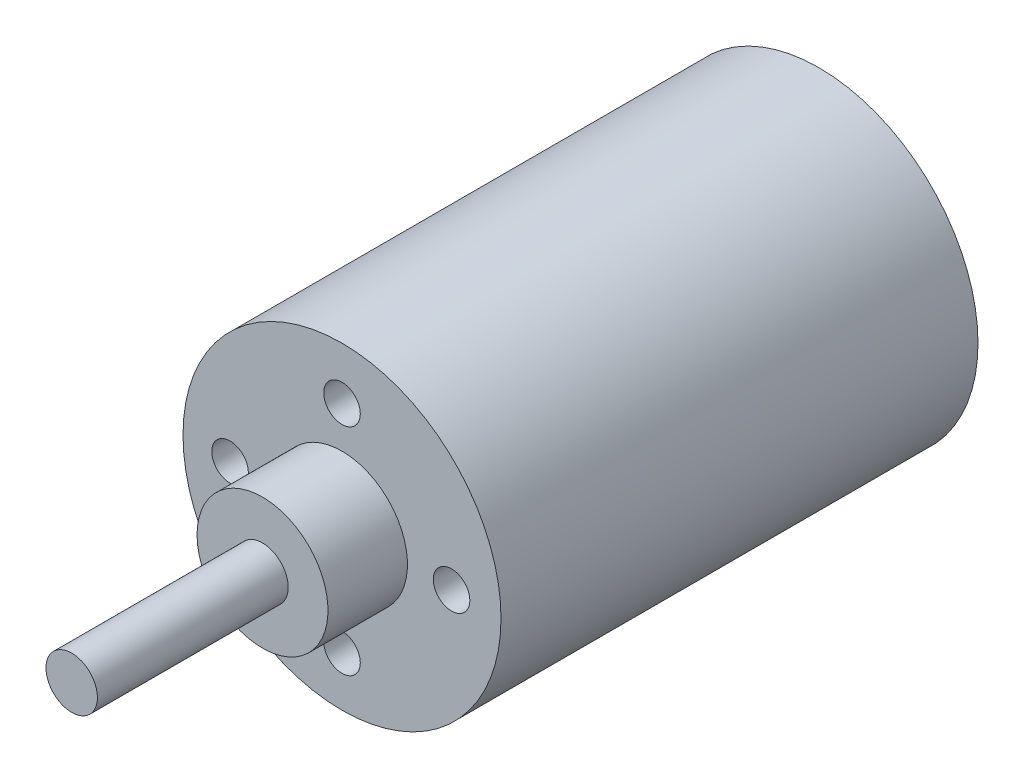
ISO-10303-21;
HEADER;
FILE_DESCRIPTION(('STEP AP214'),'2;1');
FILE_NAME('part.step','',(''),(''),'','','');
FILE_SCHEMA(('AUTOMOTIVE_DESIGN { 1 0 10303 214 1 1 1 1 }'));
ENDSEC;
DATA;
#1=APPLICATION_CONTEXT('core data for automotive mechanical design processes');
#2=APPLICATION_PROTOCOL_DEFINITION('international standard','automotive_design',2000,#1);
#3=PRODUCT_CONTEXT('',#1,'mechanical');
#4=PRODUCT('Part','Part','',(#3));
#5=PRODUCT_RELATED_PRODUCT_CATEGORY('part','',(#4));
#6=PRODUCT_DEFINITION_FORMATION('','',#4);
#7=PRODUCT_DEFINITION_CONTEXT('part definition',#1,'design');
#8=PRODUCT_DEFINITION('design','',#6,#7);
#9=PRODUCT_DEFINITION_SHAPE('','',#8);
#10=(LENGTH_UNIT() NAMED_UNIT(*) SI_UNIT(.MILLI.,.METRE.));
#11=(NAMED_UNIT(*) PLANE_ANGLE_UNIT() SI_UNIT($,.RADIAN.));
#12=(NAMED_UNIT(*) SI_UNIT($,.STERADIAN.) SOLID_ANGLE_UNIT());
#13=UNCERTAINTY_MEASURE_WITH_UNIT(LENGTH_MEASURE(1.E-05),#10,'distance_accuracy_value','');
#14=(GEOMETRIC_REPRESENTATION_CONTEXT(3) GLOBAL_UNCERTAINTY_ASSIGNED_CONTEXT((#13)) GLOBAL_UNIT_ASSIGNED_CONTEXT((#10,
#11,#12)) REPRESENTATION_CONTEXT('',''));
#15=CARTESIAN_POINT('',(0.,0.,0.));
#16=DIRECTION('',(0.,0.,1.));
#17=DIRECTION('',(1.,0.,0.));
#18=AXIS2_PLACEMENT_3D('',#15,#16,#17);
#19=CARTESIAN_POINT('',(0.,0.,-14.9999999999932));
#20=DIRECTION('',(0.,0.,-1.));
#21=DIRECTION('',(-1.,0.,0.));
#22=AXIS2_PLACEMENT_3D('',#19,#20,#21);
#23=CYLINDRICAL_SURFACE('',#22,4.11653290228397);
#24=CARTESIAN_POINT('',(0.,0.,20.));
#25=DIRECTION('',(0.,0.,-1.));
#26=DIRECTION('',(-1.,0.,0.));
#27=AXIS2_PLACEMENT_3D('',#24,#25,#26);
#28=CIRCLE('',#27,4.11653290228397);
#29=CARTESIAN_POINT('',(-4.11653290228397,0.,20.));
#30=VERTEX_POINT('',#29);
#31=EDGE_CURVE('E11',#30,#30,#28,.T.);
#32=ORIENTED_EDGE('',*,*,#31,.T.);
#33=EDGE_LOOP('',(#32));
#34=FACE_BOUND('',#33,.T.);
#35=CARTESIAN_POINT('',(0.,0.,15.));
#36=DIRECTION('',(0.,0.,-1.));
#37=DIRECTION('',(-1.,0.,0.));
#38=AXIS2_PLACEMENT_3D('',#35,#36,#37);
#39=CIRCLE('',#38,4.11653290228397);
#40=CARTESIAN_POINT('',(-4.11653290228397,0.,15.));
#41=VERTEX_POINT('',#40);
#42=EDGE_CURVE('E90',#41,#41,#39,.T.);
#43=ORIENTED_EDGE('',*,*,#42,.F.);
#44=EDGE_LOOP('',(#43));
#45=FACE_BOUND('',#44,.T.);
#46=ADVANCED_FACE('F37',(#34,#45),#23,.T.);
#47=CARTESIAN_POINT('',(0.,4.11653290228397,20.));
#48=DIRECTION('',(0.,0.,1.));
#49=DIRECTION('',(1.,0.,0.));
#50=AXIS2_PLACEMENT_3D('',#47,#48,#49);
#51=PLANE('',#50);
#52=CARTESIAN_POINT('',(0.,0.,20.));
#53=DIRECTION('',(0.,0.,-1.));
#54=DIRECTION('',(-1.,0.,0.));
#55=AXIS2_PLACEMENT_3D('',#52,#53,#54);
#56=CIRCLE('',#55,1.61653290228397);
#57=CARTESIAN_POINT('',(-1.61653290228397,0.,20.));
#58=VERTEX_POINT('',#57);
#59=EDGE_CURVE('E44',#58,#58,#56,.T.);
#60=ORIENTED_EDGE('',*,*,#59,.T.);
#61=EDGE_LOOP('',(#60));
#62=FACE_BOUND('',#61,.T.);
#63=ORIENTED_EDGE('',*,*,#31,.F.);
#64=EDGE_LOOP('',(#63));
#65=FACE_BOUND('',#64,.T.);
#66=ADVANCED_FACE('F104',(#62,#65),#51,.T.);
#67=CARTESIAN_POINT('',(0.,0.,-14.9999999999932));
#68=DIRECTION('',(0.,0.,-1.));
#69=DIRECTION('',(-1.,0.,0.));
#70=AXIS2_PLACEMENT_3D('',#67,#68,#69);
#71=CYLINDRICAL_SURFACE('',#70,1.61653290228397);
#72=CARTESIAN_POINT('',(0.,0.,32.));
#73=DIRECTION('',(0.,0.,-1.));
#74=DIRECTION('',(-1.,0.,0.));
#75=AXIS2_PLACEMENT_3D('',#72,#73,#74);
#76=CIRCLE('',#75,1.61653290228396);
#77=CARTESIAN_POINT('',(-1.61653290228396,0.,32.));
#78=VERTEX_POINT('',#77);
#79=EDGE_CURVE('E99',#78,#78,#76,.T.);
#80=ORIENTED_EDGE('',*,*,#79,.T.);
#81=EDGE_LOOP('',(#80));
#82=FACE_BOUND('',#81,.T.);
#83=ORIENTED_EDGE('',*,*,#59,.F.);
#84=EDGE_LOOP('',(#83));
#85=FACE_BOUND('',#84,.T.);
#86=ADVANCED_FACE('F107',(#82,#85),#71,.T.);
#87=CARTESIAN_POINT('',(0.,1.61653290228396,32.0000000000027));
#88=DIRECTION('',(0.,0.,1.));
#89=DIRECTION('',(1.,0.,0.));
#90=AXIS2_PLACEMENT_3D('',#87,#88,#89);
#91=PLANE('',#90);
#92=ORIENTED_EDGE('',*,*,#79,.F.);
#93=EDGE_LOOP('',(#92));
#94=FACE_BOUND('',#93,.T.);
#95=ADVANCED_FACE('F109',(#94),#91,.T.);
#96=CARTESIAN_POINT('',(0.,10.,-14.9999999999966));
#97=DIRECTION('',(0.,0.,-1.));
#98=DIRECTION('',(-1.,0.,0.));
#99=AXIS2_PLACEMENT_3D('',#96,#97,#98);
#100=PLANE('',#99);
#101=CARTESIAN_POINT('',(0.,0.,-15.));
#102=DIRECTION('',(0.,0.,-1.));
#103=DIRECTION('',(-1.,0.,0.));
#104=AXIS2_PLACEMENT_3D('',#101,#102,#103);
#105=CIRCLE('',#104,10.);
#106=CARTESIAN_POINT('',(-10.,0.,-15.));
#107=VERTEX_POINT('',#106);
#108=EDGE_CURVE('E96',#107,#107,#105,.T.);
#109=ORIENTED_EDGE('',*,*,#108,.T.);
#110=EDGE_LOOP('',(#109));
#111=FACE_BOUND('',#110,.T.);
#112=ADVANCED_FACE('F116',(#111),#100,.T.);
#113=CARTESIAN_POINT('',(0.,0.,-14.9999999999932));
#114=DIRECTION('',(0.,0.,-1.));
#115=DIRECTION('',(-1.,0.,0.));
#116=AXIS2_PLACEMENT_3D('',#113,#114,#115);
#117=CYLINDRICAL_SURFACE('',#116,10.);
#118=CARTESIAN_POINT('',(0.,0.,15.));
#119=DIRECTION('',(0.,0.,-1.));
#120=DIRECTION('',(-1.,0.,0.));
#121=AXIS2_PLACEMENT_3D('',#118,#119,#120);
#122=CIRCLE('',#121,10.);
#123=CARTESIAN_POINT('',(-10.,0.,15.));
#124=VERTEX_POINT('',#123);
#125=EDGE_CURVE('E93',#124,#124,#122,.T.);
#126=ORIENTED_EDGE('',*,*,#125,.T.);
#127=EDGE_LOOP('',(#126));
#128=FACE_BOUND('',#127,.T.);
#129=ORIENTED_EDGE('',*,*,#108,.F.);
#130=EDGE_LOOP('',(#129));
#131=FACE_BOUND('',#130,.T.);
#132=ADVANCED_FACE('F131',(#128,#131),#117,.T.);
#133=CARTESIAN_POINT('',(0.,10.,15.));
#134=DIRECTION('',(0.,0.,1.));
#135=DIRECTION('',(1.,0.,0.));
#136=AXIS2_PLACEMENT_3D('',#133,#134,#135);
#137=PLANE('',#136);
#138=CARTESIAN_POINT('',(0.,6.71915664185407,15.));
#139=DIRECTION('',(0.,0.,1.));
#140=DIRECTION('',(1.,0.,0.));
#141=AXIS2_PLACEMENT_3D('',#138,#139,#140);
#142=CIRCLE('',#141,1.14999999999999);
#143=CARTESIAN_POINT('',(1.14999999999999,6.71915664185407,15.));
#144=VERTEX_POINT('',#143);
#145=EDGE_CURVE('E68',#144,#144,#142,.T.);
#146=ORIENTED_EDGE('',*,*,#145,.F.);
#147=EDGE_LOOP('',(#146));
#148=FACE_BOUND('',#147,.T.);
#149=CARTESIAN_POINT('',(6.88943295484163,0.,15.));
#150=DIRECTION('',(0.,0.,1.));
#151=DIRECTION('',(1.,0.,0.));
#152=AXIS2_PLACEMENT_3D('',#149,#150,#151);
#153=CIRCLE('',#152,1.14999999999999);
#154=CARTESIAN_POINT('',(8.03943295484162,0.,15.));
#155=VERTEX_POINT('',#154);
#156=EDGE_CURVE('E67',#155,#155,#153,.T.);
#157=ORIENTED_EDGE('',*,*,#156,.F.);
#158=EDGE_LOOP('',(#157));
#159=FACE_BOUND('',#158,.T.);
#160=CARTESIAN_POINT('',(0.,-6.83886502488028,15.));
#161=DIRECTION('',(0.,0.,1.));
#162=DIRECTION('',(1.,0.,0.));
#163=AXIS2_PLACEMENT_3D('',#160,#161,#162);
#164=CIRCLE('',#163,1.14999999999999);
#165=CARTESIAN_POINT('',(1.14999999999999,-6.83886502488028,15.));
#166=VERTEX_POINT('',#165);
#167=EDGE_CURVE('E78',#166,#166,#164,.T.);
#168=ORIENTED_EDGE('',*,*,#167,.F.);
#169=EDGE_LOOP('',(#168));
#170=FACE_BOUND('',#169,.T.);
#171=CARTESIAN_POINT('',(-7.0410618346052,0.,15.));
#172=DIRECTION('',(0.,0.,1.));
#173=DIRECTION('',(1.,0.,0.));
#174=AXIS2_PLACEMENT_3D('',#171,#172,#173);
#175=CIRCLE('',#174,1.14999999999999);
#176=CARTESIAN_POINT('',(-5.89106183460521,0.,15.));
#177=VERTEX_POINT('',#176);
#178=EDGE_CURVE('E84',#177,#177,#175,.T.);
#179=ORIENTED_EDGE('',*,*,#178,.F.);
#180=EDGE_LOOP('',(#179));
#181=FACE_BOUND('',#180,.T.);
#182=ORIENTED_EDGE('',*,*,#42,.T.);
#183=EDGE_LOOP('',(#182));
#184=FACE_BOUND('',#183,.T.);
#185=ORIENTED_EDGE('',*,*,#125,.F.);
#186=EDGE_LOOP('',(#185));
#187=FACE_BOUND('',#186,.T.);
#188=ADVANCED_FACE('F127',(#148,#159,#170,#181,#184,#187),#137,.T.);
#189=CARTESIAN_POINT('',(-7.0410618346052,0.,12.));
#190=DIRECTION('',(0.,0.,1.));
#191=DIRECTION('',(1.,0.,0.));
#192=AXIS2_PLACEMENT_3D('',#189,#190,#191);
#193=CONICAL_SURFACE('',#192,1.15,1.02974425867665);
#194=CARTESIAN_POINT('',(-7.0410618346052,0.,11.3090102881183));
#195=VERTEX_POINT('',#194);
#196=VERTEX_LOOP('',#195);
#197=FACE_BOUND('',#196,.T.);
#198=CARTESIAN_POINT('',(-7.0410618346052,0.,12.));
#199=DIRECTION('',(0.,0.,1.));
#200=DIRECTION('',(1.,0.,0.));
#201=AXIS2_PLACEMENT_3D('',#198,#199,#200);
#202=CIRCLE('',#201,1.15);
#203=CARTESIAN_POINT('',(-5.8910618346052,0.,12.));
#204=VERTEX_POINT('',#203);
#205=EDGE_CURVE('E87',#204,#204,#202,.T.);
#206=ORIENTED_EDGE('',*,*,#205,.T.);
#207=EDGE_LOOP('',(#206));
#208=FACE_BOUND('',#207,.T.);
#209=ADVANCED_FACE('F130',(#197,#208),#193,.F.);
#210=CARTESIAN_POINT('',(-7.0410618346052,0.,15.));
#211=DIRECTION('',(0.,0.,1.));
#212=DIRECTION('',(1.,0.,0.));
#213=AXIS2_PLACEMENT_3D('',#210,#211,#212);
#214=CYLINDRICAL_SURFACE('',#213,1.14999999999999);
#215=ORIENTED_EDGE('',*,*,#205,.F.);
#216=EDGE_LOOP('',(#215));
#217=FACE_BOUND('',#216,.T.);
#218=ORIENTED_EDGE('',*,*,#178,.T.);
#219=EDGE_LOOP('',(#218));
#220=FACE_BOUND('',#219,.T.);
#221=ADVANCED_FACE('F148',(#217,#220),#214,.F.);
#222=CARTESIAN_POINT('',(0.,-6.83886502488028,12.));
#223=DIRECTION('',(0.,0.,1.));
#224=DIRECTION('',(1.,0.,0.));
#225=AXIS2_PLACEMENT_3D('',#222,#223,#224);
#226=CONICAL_SURFACE('',#225,1.15,1.02974425867665);
#227=CARTESIAN_POINT('',(0.,-6.83886502488028,11.3090102881183));
#228=VERTEX_POINT('',#227);
#229=VERTEX_LOOP('',#228);
#230=FACE_BOUND('',#229,.T.);
#231=CARTESIAN_POINT('',(0.,-6.83886502488028,12.));
#232=DIRECTION('',(0.,0.,1.));
#233=DIRECTION('',(1.,0.,0.));
#234=AXIS2_PLACEMENT_3D('',#231,#232,#233);
#235=CIRCLE('',#234,1.15);
#236=CARTESIAN_POINT('',(1.15,-6.83886502488028,12.));
#237=VERTEX_POINT('',#236);
#238=EDGE_CURVE('E81',#237,#237,#235,.T.);
#239=ORIENTED_EDGE('',*,*,#238,.T.);
#240=EDGE_LOOP('',(#239));
#241=FACE_BOUND('',#240,.T.);
#242=ADVANCED_FACE('F151',(#230,#241),#226,.F.);
#243=CARTESIAN_POINT('',(0.,-6.83886502488028,15.));
#244=DIRECTION('',(0.,0.,1.));
#245=DIRECTION('',(1.,0.,0.));
#246=AXIS2_PLACEMENT_3D('',#243,#244,#245);
#247=CYLINDRICAL_SURFACE('',#246,1.14999999999999);
#248=ORIENTED_EDGE('',*,*,#238,.F.);
#249=EDGE_LOOP('',(#248));
#250=FACE_BOUND('',#249,.T.);
#251=ORIENTED_EDGE('',*,*,#167,.T.);
#252=EDGE_LOOP('',(#251));
#253=FACE_BOUND('',#252,.T.);
#254=ADVANCED_FACE('F155',(#250,#253),#247,.F.);
#255=CARTESIAN_POINT('',(6.88943295484163,0.,12.));
#256=DIRECTION('',(0.,0.,1.));
#257=DIRECTION('',(1.,0.,0.));
#258=AXIS2_PLACEMENT_3D('',#255,#256,#257);
#259=CONICAL_SURFACE('',#258,1.15,1.02974425867665);
#260=CARTESIAN_POINT('',(6.88943295484163,0.,11.3090102881183));
#261=VERTEX_POINT('',#260);
#262=VERTEX_LOOP('',#261);
#263=FACE_BOUND('',#262,.T.);
#264=CARTESIAN_POINT('',(6.88943295484163,0.,12.));
#265=DIRECTION('',(0.,0.,1.));
#266=DIRECTION('',(1.,0.,0.));
#267=AXIS2_PLACEMENT_3D('',#264,#265,#266);
#268=CIRCLE('',#267,1.15);
#269=CARTESIAN_POINT('',(8.03943295484163,0.,12.));
#270=VERTEX_POINT('',#269);
#271=EDGE_CURVE('E71',#270,#270,#268,.T.);
#272=ORIENTED_EDGE('',*,*,#271,.T.);
#273=EDGE_LOOP('',(#272));
#274=FACE_BOUND('',#273,.T.);
#275=ADVANCED_FACE('F158',(#263,#274),#259,.F.);
#276=CARTESIAN_POINT('',(6.88943295484163,0.,15.));
#277=DIRECTION('',(0.,0.,1.));
#278=DIRECTION('',(1.,0.,0.));
#279=AXIS2_PLACEMENT_3D('',#276,#277,#278);
#280=CYLINDRICAL_SURFACE('',#279,1.14999999999999);
#281=ORIENTED_EDGE('',*,*,#271,.F.);
#282=EDGE_LOOP('',(#281));
#283=FACE_BOUND('',#282,.T.);
#284=ORIENTED_EDGE('',*,*,#156,.T.);
#285=EDGE_LOOP('',(#284));
#286=FACE_BOUND('',#285,.T.);
#287=ADVANCED_FACE('F61',(#283,#286),#280,.F.);
#288=CARTESIAN_POINT('',(0.,6.71915664185407,12.));
#289=DIRECTION('',(0.,0.,1.));
#290=DIRECTION('',(1.,0.,0.));
#291=AXIS2_PLACEMENT_3D('',#288,#289,#290);
#292=CONICAL_SURFACE('',#291,1.15,1.02974425867665);
#293=CARTESIAN_POINT('',(0.,6.71915664185407,11.3090102881183));
#294=VERTEX_POINT('',#293);
#295=VERTEX_LOOP('',#294);
#296=FACE_BOUND('',#295,.T.);
#297=CARTESIAN_POINT('',(0.,6.71915664185407,12.));
#298=DIRECTION('',(0.,0.,1.));
#299=DIRECTION('',(1.,0.,0.));
#300=AXIS2_PLACEMENT_3D('',#297,#298,#299);
#301=CIRCLE('',#300,1.15);
#302=CARTESIAN_POINT('',(1.15,6.71915664185407,12.));
#303=VERTEX_POINT('',#302);
#304=EDGE_CURVE('E65',#303,#303,#301,.T.);
#305=ORIENTED_EDGE('',*,*,#304,.T.);
#306=EDGE_LOOP('',(#305));
#307=FACE_BOUND('',#306,.T.);
#308=ADVANCED_FACE('F57',(#296,#307),#292,.F.);
#309=CARTESIAN_POINT('',(0.,6.71915664185407,15.));
#310=DIRECTION('',(0.,0.,1.));
#311=DIRECTION('',(1.,0.,0.));
#312=AXIS2_PLACEMENT_3D('',#309,#310,#311);
#313=CYLINDRICAL_SURFACE('',#312,1.14999999999999);
#314=ORIENTED_EDGE('',*,*,#304,.F.);
#315=EDGE_LOOP('',(#314));
#316=FACE_BOUND('',#315,.T.);
#317=ORIENTED_EDGE('',*,*,#145,.T.);
#318=EDGE_LOOP('',(#317));
#319=FACE_BOUND('',#318,.T.);
#320=ADVANCED_FACE('F60',(#316,#319),#313,.F.);
#321=CLOSED_SHELL('',(#46,#66,#86,#95,#112,#132,#188,#209,#221,#242,#254,#275,#287,#308,#320));
#322=MANIFOLD_SOLID_BREP('B2',#321);
#323=ADVANCED_BREP_SHAPE_REPRESENTATION('',(#18,#322),#14);
#324=SHAPE_DEFINITION_REPRESENTATION(#9,#323);
ENDSEC;
END-ISO-10303-21;
